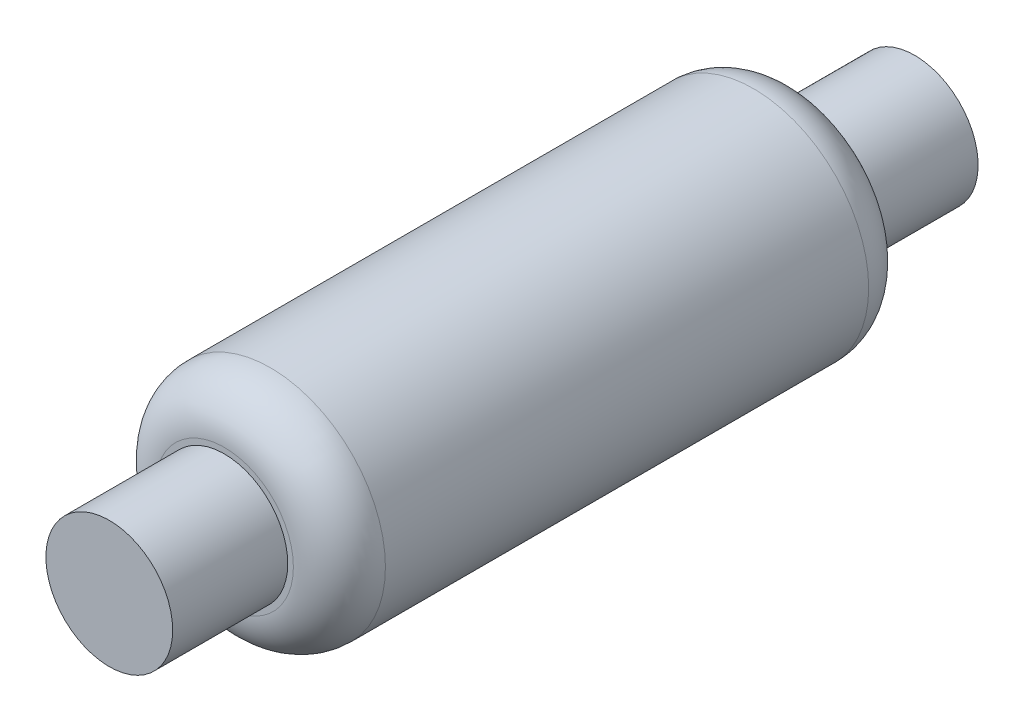
ISO-10303-21;
HEADER;
FILE_DESCRIPTION(('STEP AP214'),'2;1');
FILE_NAME('part.step','',(''),(''),'','','');
FILE_SCHEMA(('AUTOMOTIVE_DESIGN { 1 0 10303 214 1 1 1 1 }'));
ENDSEC;
DATA;
#1=APPLICATION_CONTEXT('core data for automotive mechanical design processes');
#2=APPLICATION_PROTOCOL_DEFINITION('international standard','automotive_design',2000,#1);
#3=PRODUCT_CONTEXT('',#1,'mechanical');
#4=PRODUCT('Part','Part','',(#3));
#5=PRODUCT_RELATED_PRODUCT_CATEGORY('part','',(#4));
#6=PRODUCT_DEFINITION_FORMATION('','',#4);
#7=PRODUCT_DEFINITION_CONTEXT('part definition',#1,'design');
#8=PRODUCT_DEFINITION('design','',#6,#7);
#9=PRODUCT_DEFINITION_SHAPE('','',#8);
#10=(LENGTH_UNIT() NAMED_UNIT(*) SI_UNIT(.MILLI.,.METRE.));
#11=(NAMED_UNIT(*) PLANE_ANGLE_UNIT() SI_UNIT($,.RADIAN.));
#12=(NAMED_UNIT(*) SI_UNIT($,.STERADIAN.) SOLID_ANGLE_UNIT());
#13=UNCERTAINTY_MEASURE_WITH_UNIT(LENGTH_MEASURE(1.E-05),#10,'distance_accuracy_value','');
#14=(GEOMETRIC_REPRESENTATION_CONTEXT(3) GLOBAL_UNCERTAINTY_ASSIGNED_CONTEXT((#13)) GLOBAL_UNIT_ASSIGNED_CONTEXT((#10,
#11,#12)) REPRESENTATION_CONTEXT('',''));
#15=CARTESIAN_POINT('',(0.,0.,0.));
#16=DIRECTION('',(0.,0.,1.));
#17=DIRECTION('',(1.,0.,0.));
#18=AXIS2_PLACEMENT_3D('',#15,#16,#17);
#19=CARTESIAN_POINT('',(0.,0.,25.));
#20=DIRECTION('',(0.,0.,-1.));
#21=DIRECTION('',(-1.,0.,0.));
#22=AXIS2_PLACEMENT_3D('',#19,#20,#21);
#23=CYLINDRICAL_SURFACE('',#22,5.);
#24=CARTESIAN_POINT('',(0.,0.,23.));
#25=DIRECTION('',(0.,0.,1.));
#26=DIRECTION('',(1.,0.,0.));
#27=AXIS2_PLACEMENT_3D('',#24,#25,#26);
#28=CIRCLE('',#27,5.);
#29=CARTESIAN_POINT('',(5.,0.,23.));
#30=VERTEX_POINT('',#29);
#31=EDGE_CURVE('E10',#30,#30,#28,.F.);
#32=ORIENTED_EDGE('',*,*,#31,.T.);
#33=EDGE_LOOP('',(#32));
#34=FACE_BOUND('',#33,.T.);
#35=CARTESIAN_POINT('',(0.,0.,2.));
#36=DIRECTION('',(0.,0.,1.));
#37=DIRECTION('',(1.,0.,0.));
#38=AXIS2_PLACEMENT_3D('',#35,#36,#37);
#39=CIRCLE('',#38,5.);
#40=CARTESIAN_POINT('',(5.,0.,2.));
#41=VERTEX_POINT('',#40);
#42=EDGE_CURVE('E50',#41,#41,#39,.T.);
#43=ORIENTED_EDGE('',*,*,#42,.T.);
#44=EDGE_LOOP('',(#43));
#45=FACE_BOUND('',#44,.T.);
#46=ADVANCED_FACE('F35',(#34,#45),#23,.T.);
#47=CARTESIAN_POINT('',(0.,0.,25.));
#48=DIRECTION('',(0.,0.,1.));
#49=DIRECTION('',(1.,0.,0.));
#50=AXIS2_PLACEMENT_3D('',#47,#48,#49);
#51=PLANE('',#50);
#52=CARTESIAN_POINT('',(0.,0.,25.));
#53=DIRECTION('',(0.,0.,1.));
#54=DIRECTION('',(1.,0.,0.));
#55=AXIS2_PLACEMENT_3D('',#52,#53,#54);
#56=CIRCLE('',#55,3.);
#57=CARTESIAN_POINT('',(3.,0.,25.));
#58=VERTEX_POINT('',#57);
#59=EDGE_CURVE('E42',#58,#58,#56,.T.);
#60=ORIENTED_EDGE('',*,*,#59,.T.);
#61=EDGE_LOOP('',(#60));
#62=FACE_BOUND('',#61,.T.);
#63=CARTESIAN_POINT('',(0.,0.,25.));
#64=DIRECTION('',(0.,0.,1.));
#65=DIRECTION('',(1.,0.,0.));
#66=AXIS2_PLACEMENT_3D('',#63,#64,#65);
#67=CIRCLE('',#66,2.755);
#68=CARTESIAN_POINT('',(2.755,0.,25.));
#69=VERTEX_POINT('',#68);
#70=EDGE_CURVE('E56',#69,#69,#67,.T.);
#71=ORIENTED_EDGE('',*,*,#70,.F.);
#72=EDGE_LOOP('',(#71));
#73=FACE_BOUND('',#72,.T.);
#74=ADVANCED_FACE('F80',(#62,#73),#51,.T.);
#75=CARTESIAN_POINT('',(0.,0.,0.));
#76=DIRECTION('',(0.,0.,1.));
#77=DIRECTION('',(1.,0.,0.));
#78=AXIS2_PLACEMENT_3D('',#75,#76,#77);
#79=PLANE('',#78);
#80=CARTESIAN_POINT('',(0.,0.,0.));
#81=DIRECTION('',(0.,0.,1.));
#82=DIRECTION('',(1.,0.,0.));
#83=AXIS2_PLACEMENT_3D('',#80,#81,#82);
#84=CIRCLE('',#83,3.);
#85=CARTESIAN_POINT('',(3.,0.,0.));
#86=VERTEX_POINT('',#85);
#87=EDGE_CURVE('E46',#86,#86,#84,.F.);
#88=ORIENTED_EDGE('',*,*,#87,.T.);
#89=EDGE_LOOP('',(#88));
#90=FACE_BOUND('',#89,.T.);
#91=CARTESIAN_POINT('',(0.,0.,0.));
#92=DIRECTION('',(0.,0.,-1.));
#93=DIRECTION('',(-1.,0.,0.));
#94=AXIS2_PLACEMENT_3D('',#91,#92,#93);
#95=CIRCLE('',#94,2.755);
#96=CARTESIAN_POINT('',(-2.755,0.,0.));
#97=VERTEX_POINT('',#96);
#98=EDGE_CURVE('E55',#97,#97,#95,.T.);
#99=ORIENTED_EDGE('',*,*,#98,.F.);
#100=EDGE_LOOP('',(#99));
#101=FACE_BOUND('',#100,.T.);
#102=ADVANCED_FACE('F77',(#90,#101),#79,.F.);
#103=CARTESIAN_POINT('',(0.,0.,30.));
#104=DIRECTION('',(0.,0.,-1.));
#105=DIRECTION('',(-1.,0.,0.));
#106=AXIS2_PLACEMENT_3D('',#103,#104,#105);
#107=CYLINDRICAL_SURFACE('',#106,2.755);
#108=CARTESIAN_POINT('',(0.,0.,30.));
#109=DIRECTION('',(0.,0.,1.));
#110=DIRECTION('',(1.,0.,0.));
#111=AXIS2_PLACEMENT_3D('',#108,#109,#110);
#112=CIRCLE('',#111,2.755);
#113=CARTESIAN_POINT('',(2.755,0.,30.));
#114=VERTEX_POINT('',#113);
#115=EDGE_CURVE('E59',#114,#114,#112,.T.);
#116=ORIENTED_EDGE('',*,*,#115,.F.);
#117=EDGE_LOOP('',(#116));
#118=FACE_BOUND('',#117,.T.);
#119=ORIENTED_EDGE('',*,*,#70,.T.);
#120=EDGE_LOOP('',(#119));
#121=FACE_BOUND('',#120,.T.);
#122=ADVANCED_FACE('F79',(#118,#121),#107,.T.);
#123=CARTESIAN_POINT('',(0.,0.,30.));
#124=DIRECTION('',(0.,0.,1.));
#125=DIRECTION('',(1.,0.,0.));
#126=AXIS2_PLACEMENT_3D('',#123,#124,#125);
#127=PLANE('',#126);
#128=ORIENTED_EDGE('',*,*,#115,.T.);
#129=EDGE_LOOP('',(#128));
#130=FACE_BOUND('',#129,.T.);
#131=ADVANCED_FACE('F73',(#130),#127,.T.);
#132=CARTESIAN_POINT('',(0.,0.,-5.));
#133=DIRECTION('',(0.,0.,1.));
#134=DIRECTION('',(1.,0.,0.));
#135=AXIS2_PLACEMENT_3D('',#132,#133,#134);
#136=CYLINDRICAL_SURFACE('',#135,2.755);
#137=CARTESIAN_POINT('',(0.,0.,-5.));
#138=DIRECTION('',(0.,0.,-1.));
#139=DIRECTION('',(-1.,0.,0.));
#140=AXIS2_PLACEMENT_3D('',#137,#138,#139);
#141=CIRCLE('',#140,2.755);
#142=CARTESIAN_POINT('',(-2.755,0.,-5.));
#143=VERTEX_POINT('',#142);
#144=EDGE_CURVE('E62',#143,#143,#141,.T.);
#145=ORIENTED_EDGE('',*,*,#144,.F.);
#146=EDGE_LOOP('',(#145));
#147=FACE_BOUND('',#146,.T.);
#148=ORIENTED_EDGE('',*,*,#98,.T.);
#149=EDGE_LOOP('',(#148));
#150=FACE_BOUND('',#149,.T.);
#151=ADVANCED_FACE('F70',(#147,#150),#136,.T.);
#152=CARTESIAN_POINT('',(0.,0.,-5.));
#153=DIRECTION('',(0.,0.,-1.));
#154=DIRECTION('',(-1.,0.,0.));
#155=AXIS2_PLACEMENT_3D('',#152,#153,#154);
#156=PLANE('',#155);
#157=ORIENTED_EDGE('',*,*,#144,.T.);
#158=EDGE_LOOP('',(#157));
#159=FACE_BOUND('',#158,.T.);
#160=ADVANCED_FACE('F68',(#159),#156,.T.);
#161=CARTESIAN_POINT('',(0.,0.,2.));
#162=DIRECTION('',(0.,0.,1.));
#163=DIRECTION('',(1.,0.,0.));
#164=AXIS2_PLACEMENT_3D('',#161,#162,#163);
#165=TOROIDAL_SURFACE('',#164,3.,2.);
#166=ORIENTED_EDGE('',*,*,#87,.F.);
#167=EDGE_LOOP('',(#166));
#168=FACE_BOUND('',#167,.T.);
#169=ORIENTED_EDGE('',*,*,#42,.F.);
#170=EDGE_LOOP('',(#169));
#171=FACE_BOUND('',#170,.T.);
#172=ADVANCED_FACE('F95',(#168,#171),#165,.T.);
#173=CARTESIAN_POINT('',(0.,0.,23.));
#174=DIRECTION('',(0.,0.,1.));
#175=DIRECTION('',(1.,0.,0.));
#176=AXIS2_PLACEMENT_3D('',#173,#174,#175);
#177=TOROIDAL_SURFACE('',#176,3.,2.);
#178=ORIENTED_EDGE('',*,*,#31,.F.);
#179=EDGE_LOOP('',(#178));
#180=FACE_BOUND('',#179,.T.);
#181=ORIENTED_EDGE('',*,*,#59,.F.);
#182=EDGE_LOOP('',(#181));
#183=FACE_BOUND('',#182,.T.);
#184=ADVANCED_FACE('F37',(#180,#183),#177,.T.);
#185=CLOSED_SHELL('',(#46,#74,#102,#122,#131,#151,#160,#172,#184));
#186=MANIFOLD_SOLID_BREP('B2',#185);
#187=ADVANCED_BREP_SHAPE_REPRESENTATION('',(#18,#186),#14);
#188=SHAPE_DEFINITION_REPRESENTATION(#9,#187);
ENDSEC;
END-ISO-10303-21;
